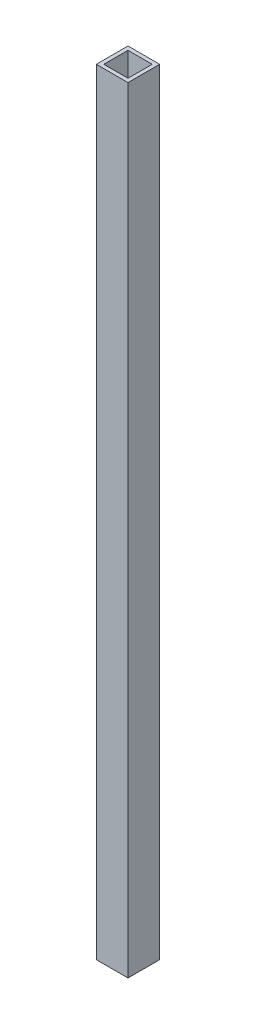
ISO-10303-21;
HEADER;
FILE_DESCRIPTION(('STEP AP214'),'2;1');
FILE_NAME('part.step','',(''),(''),'','','');
FILE_SCHEMA(('AUTOMOTIVE_DESIGN { 1 0 10303 214 1 1 1 1 }'));
ENDSEC;
DATA;
#1=APPLICATION_CONTEXT('core data for automotive mechanical design processes');
#2=APPLICATION_PROTOCOL_DEFINITION('international standard','automotive_design',2000,#1);
#3=PRODUCT_CONTEXT('',#1,'mechanical');
#4=PRODUCT('Part','Part','',(#3));
#5=PRODUCT_RELATED_PRODUCT_CATEGORY('part','',(#4));
#6=PRODUCT_DEFINITION_FORMATION('','',#4);
#7=PRODUCT_DEFINITION_CONTEXT('part definition',#1,'design');
#8=PRODUCT_DEFINITION('design','',#6,#7);
#9=PRODUCT_DEFINITION_SHAPE('','',#8);
#10=(LENGTH_UNIT() NAMED_UNIT(*) SI_UNIT(.MILLI.,.METRE.));
#11=(NAMED_UNIT(*) PLANE_ANGLE_UNIT() SI_UNIT($,.RADIAN.));
#12=(NAMED_UNIT(*) SI_UNIT($,.STERADIAN.) SOLID_ANGLE_UNIT());
#13=UNCERTAINTY_MEASURE_WITH_UNIT(LENGTH_MEASURE(1.E-05),#10,'distance_accuracy_value','');
#14=(GEOMETRIC_REPRESENTATION_CONTEXT(3) GLOBAL_UNCERTAINTY_ASSIGNED_CONTEXT((#13)) GLOBAL_UNIT_ASSIGNED_CONTEXT((#10,
#11,#12)) REPRESENTATION_CONTEXT('',''));
#15=CARTESIAN_POINT('',(0.,0.,0.));
#16=DIRECTION('',(0.,0.,1.));
#17=DIRECTION('',(1.,0.,0.));
#18=AXIS2_PLACEMENT_3D('',#15,#16,#17);
#19=CARTESIAN_POINT('',(0.,208.245,0.));
#20=DIRECTION('',(0.,-1.,0.));
#21=DIRECTION('',(0.,0.,-1.));
#22=AXIS2_PLACEMENT_3D('',#19,#20,#21);
#23=PLANE('',#22);
#24=DIRECTION('',(0.,0.,1.));
#25=VECTOR('',#24,1.);
#26=CARTESIAN_POINT('',(15.8767045454545,208.245,-21.8352272727272));
#27=LINE('',#26,#25);
#28=CARTESIAN_POINT('',(15.8767045454545,208.245,-30.3352272727272));
#29=VERTEX_POINT('',#28);
#30=CARTESIAN_POINT('',(15.8767045454545,208.245,-21.8352272727272));
#31=VERTEX_POINT('',#30);
#32=EDGE_CURVE('E156',#29,#31,#27,.T.);
#33=ORIENTED_EDGE('',*,*,#32,.T.);
#34=DIRECTION('',(1.,0.,0.));
#35=VECTOR('',#34,1.);
#36=CARTESIAN_POINT('',(15.8767045454545,208.245,-21.8352272727272));
#37=LINE('',#36,#35);
#38=CARTESIAN_POINT('',(24.3767045454545,208.245,-21.8352272727272));
#39=VERTEX_POINT('',#38);
#40=EDGE_CURVE('E160',#31,#39,#37,.T.);
#41=ORIENTED_EDGE('',*,*,#40,.T.);
#42=DIRECTION('',(0.,0.,-1.));
#43=VECTOR('',#42,1.);
#44=CARTESIAN_POINT('',(24.3767045454545,208.245,-21.8352272727272));
#45=LINE('',#44,#43);
#46=CARTESIAN_POINT('',(24.3767045454545,208.245,-30.3352272727272));
#47=VERTEX_POINT('',#46);
#48=EDGE_CURVE('E164',#39,#47,#45,.T.);
#49=ORIENTED_EDGE('',*,*,#48,.T.);
#50=DIRECTION('',(-1.,0.,0.));
#51=VECTOR('',#50,1.);
#52=CARTESIAN_POINT('',(15.8767045454545,208.245,-30.3352272727272));
#53=LINE('',#52,#51);
#54=EDGE_CURVE('E167',#47,#29,#53,.T.);
#55=ORIENTED_EDGE('',*,*,#54,.T.);
#56=EDGE_LOOP('',(#33,#41,#49,#55));
#57=FACE_BOUND('',#56,.T.);
#58=DIRECTION('',(0.,0.,1.));
#59=VECTOR('',#58,1.);
#60=CARTESIAN_POINT('',(16.8767045454545,208.245,-29.3352272727272));
#61=LINE('',#60,#59);
#62=CARTESIAN_POINT('',(16.8767045454545,208.245,-29.3352272727272));
#63=VERTEX_POINT('',#62);
#64=CARTESIAN_POINT('',(16.8767045454545,208.245,-22.8352272727272));
#65=VERTEX_POINT('',#64);
#66=EDGE_CURVE('E108',#63,#65,#61,.T.);
#67=ORIENTED_EDGE('',*,*,#66,.F.);
#68=DIRECTION('',(-1.,0.,0.));
#69=VECTOR('',#68,1.);
#70=CARTESIAN_POINT('',(16.8767045454545,208.245,-29.3352272727272));
#71=LINE('',#70,#69);
#72=CARTESIAN_POINT('',(23.3767045454545,208.245,-29.3352272727272));
#73=VERTEX_POINT('',#72);
#74=EDGE_CURVE('E134',#73,#63,#71,.T.);
#75=ORIENTED_EDGE('',*,*,#74,.F.);
#76=DIRECTION('',(0.,0.,-1.));
#77=VECTOR('',#76,1.);
#78=CARTESIAN_POINT('',(23.3767045454545,208.245,-29.3352272727272));
#79=LINE('',#78,#77);
#80=CARTESIAN_POINT('',(23.3767045454545,208.245,-22.8352272727272));
#81=VERTEX_POINT('',#80);
#82=EDGE_CURVE('E130',#81,#73,#79,.T.);
#83=ORIENTED_EDGE('',*,*,#82,.F.);
#84=DIRECTION('',(1.,0.,0.));
#85=VECTOR('',#84,1.);
#86=CARTESIAN_POINT('',(16.8767045454545,208.245,-22.8352272727272));
#87=LINE('',#86,#85);
#88=EDGE_CURVE('E117',#65,#81,#87,.T.);
#89=ORIENTED_EDGE('',*,*,#88,.F.);
#90=EDGE_LOOP('',(#67,#75,#83,#89));
#91=FACE_BOUND('',#90,.T.);
#92=ADVANCED_FACE('F42',(#57,#91),#23,.F.);
#93=CARTESIAN_POINT('',(0.,0.,0.));
#94=DIRECTION('',(0.,-1.,0.));
#95=DIRECTION('',(0.,0.,-1.));
#96=AXIS2_PLACEMENT_3D('',#93,#94,#95);
#97=PLANE('',#96);
#98=DIRECTION('',(0.,0.,1.));
#99=VECTOR('',#98,1.);
#100=CARTESIAN_POINT('',(15.8767045454545,0.,-21.8352272727272));
#101=LINE('',#100,#99);
#102=CARTESIAN_POINT('',(15.8767045454545,0.,-30.3352272727272));
#103=VERTEX_POINT('',#102);
#104=CARTESIAN_POINT('',(15.8767045454545,0.,-21.8352272727272));
#105=VERTEX_POINT('',#104);
#106=EDGE_CURVE('E126',#103,#105,#101,.T.);
#107=ORIENTED_EDGE('',*,*,#106,.F.);
#108=DIRECTION('',(-1.,0.,0.));
#109=VECTOR('',#108,1.);
#110=CARTESIAN_POINT('',(15.8767045454545,0.,-30.3352272727272));
#111=LINE('',#110,#109);
#112=CARTESIAN_POINT('',(24.3767045454545,0.,-30.3352272727272));
#113=VERTEX_POINT('',#112);
#114=EDGE_CURVE('E161',#113,#103,#111,.T.);
#115=ORIENTED_EDGE('',*,*,#114,.F.);
#116=DIRECTION('',(0.,0.,-1.));
#117=VECTOR('',#116,1.);
#118=CARTESIAN_POINT('',(24.3767045454545,0.,-21.8352272727272));
#119=LINE('',#118,#117);
#120=CARTESIAN_POINT('',(24.3767045454545,0.,-21.8352272727272));
#121=VERTEX_POINT('',#120);
#122=EDGE_CURVE('E177',#121,#113,#119,.T.);
#123=ORIENTED_EDGE('',*,*,#122,.F.);
#124=DIRECTION('',(1.,0.,0.));
#125=VECTOR('',#124,1.);
#126=CARTESIAN_POINT('',(15.8767045454545,0.,-21.8352272727272));
#127=LINE('',#126,#125);
#128=EDGE_CURVE('E174',#105,#121,#127,.T.);
#129=ORIENTED_EDGE('',*,*,#128,.F.);
#130=EDGE_LOOP('',(#107,#115,#123,#129));
#131=FACE_BOUND('',#130,.T.);
#132=DIRECTION('',(-1.,0.,0.));
#133=VECTOR('',#132,1.);
#134=CARTESIAN_POINT('',(16.8767045454545,0.,-29.3352272727272));
#135=LINE('',#134,#133);
#136=CARTESIAN_POINT('',(23.3767045454545,0.,-29.3352272727272));
#137=VERTEX_POINT('',#136);
#138=CARTESIAN_POINT('',(16.8767045454545,0.,-29.3352272727272));
#139=VERTEX_POINT('',#138);
#140=EDGE_CURVE('E118',#137,#139,#135,.T.);
#141=ORIENTED_EDGE('',*,*,#140,.T.);
#142=DIRECTION('',(0.,0.,1.));
#143=VECTOR('',#142,1.);
#144=CARTESIAN_POINT('',(16.8767045454545,0.,-29.3352272727272));
#145=LINE('',#144,#143);
#146=CARTESIAN_POINT('',(16.8767045454545,0.,-22.8352272727272));
#147=VERTEX_POINT('',#146);
#148=EDGE_CURVE('E66',#139,#147,#145,.T.);
#149=ORIENTED_EDGE('',*,*,#148,.T.);
#150=DIRECTION('',(1.,0.,0.));
#151=VECTOR('',#150,1.);
#152=CARTESIAN_POINT('',(16.8767045454545,0.,-22.8352272727272));
#153=LINE('',#152,#151);
#154=CARTESIAN_POINT('',(23.3767045454545,0.,-22.8352272727272));
#155=VERTEX_POINT('',#154);
#156=EDGE_CURVE('E124',#147,#155,#153,.T.);
#157=ORIENTED_EDGE('',*,*,#156,.T.);
#158=DIRECTION('',(0.,0.,-1.));
#159=VECTOR('',#158,1.);
#160=CARTESIAN_POINT('',(23.3767045454545,0.,-29.3352272727272));
#161=LINE('',#160,#159);
#162=EDGE_CURVE('E143',#155,#137,#161,.T.);
#163=ORIENTED_EDGE('',*,*,#162,.T.);
#164=EDGE_LOOP('',(#141,#149,#157,#163));
#165=FACE_BOUND('',#164,.T.);
#166=ADVANCED_FACE('F200',(#131,#165),#97,.T.);
#167=CARTESIAN_POINT('',(15.8767045454545,208.245,-21.8352272727272));
#168=DIRECTION('',(1.,0.,0.));
#169=DIRECTION('',(0.,0.,-1.));
#170=AXIS2_PLACEMENT_3D('',#167,#168,#169);
#171=PLANE('',#170);
#172=ORIENTED_EDGE('',*,*,#106,.T.);
#173=DIRECTION('',(0.,-1.,0.));
#174=VECTOR('',#173,1.);
#175=CARTESIAN_POINT('',(15.8767045454545,208.245,-21.8352272727272));
#176=LINE('',#175,#174);
#177=EDGE_CURVE('E11',#31,#105,#176,.T.);
#178=ORIENTED_EDGE('',*,*,#177,.F.);
#179=ORIENTED_EDGE('',*,*,#32,.F.);
#180=DIRECTION('',(0.,-1.,0.));
#181=VECTOR('',#180,1.);
#182=CARTESIAN_POINT('',(15.8767045454545,208.245,-30.3352272727272));
#183=LINE('',#182,#181);
#184=EDGE_CURVE('E170',#29,#103,#183,.T.);
#185=ORIENTED_EDGE('',*,*,#184,.T.);
#186=EDGE_LOOP('',(#172,#178,#179,#185));
#187=FACE_BOUND('',#186,.T.);
#188=ADVANCED_FACE('F44',(#187),#171,.F.);
#189=CARTESIAN_POINT('',(15.8767045454545,208.245,-21.8352272727272));
#190=DIRECTION('',(0.,0.,-1.));
#191=DIRECTION('',(-1.,0.,0.));
#192=AXIS2_PLACEMENT_3D('',#189,#190,#191);
#193=PLANE('',#192);
#194=ORIENTED_EDGE('',*,*,#128,.T.);
#195=DIRECTION('',(0.,-1.,0.));
#196=VECTOR('',#195,1.);
#197=CARTESIAN_POINT('',(24.3767045454545,208.245,-21.8352272727272));
#198=LINE('',#197,#196);
#199=EDGE_CURVE('E51',#39,#121,#198,.T.);
#200=ORIENTED_EDGE('',*,*,#199,.F.);
#201=ORIENTED_EDGE('',*,*,#40,.F.);
#202=ORIENTED_EDGE('',*,*,#177,.T.);
#203=EDGE_LOOP('',(#194,#200,#201,#202));
#204=FACE_BOUND('',#203,.T.);
#205=ADVANCED_FACE('F210',(#204),#193,.F.);
#206=CARTESIAN_POINT('',(24.3767045454545,208.245,-21.8352272727272));
#207=DIRECTION('',(-1.,0.,0.));
#208=DIRECTION('',(0.,0.,1.));
#209=AXIS2_PLACEMENT_3D('',#206,#207,#208);
#210=PLANE('',#209);
#211=ORIENTED_EDGE('',*,*,#122,.T.);
#212=DIRECTION('',(0.,-1.,0.));
#213=VECTOR('',#212,1.);
#214=CARTESIAN_POINT('',(24.3767045454545,208.245,-30.3352272727272));
#215=LINE('',#214,#213);
#216=EDGE_CURVE('E185',#47,#113,#215,.T.);
#217=ORIENTED_EDGE('',*,*,#216,.F.);
#218=ORIENTED_EDGE('',*,*,#48,.F.);
#219=ORIENTED_EDGE('',*,*,#199,.T.);
#220=EDGE_LOOP('',(#211,#217,#218,#219));
#221=FACE_BOUND('',#220,.T.);
#222=ADVANCED_FACE('F194',(#221),#210,.F.);
#223=CARTESIAN_POINT('',(15.8767045454545,208.245,-30.3352272727272));
#224=DIRECTION('',(0.,0.,1.));
#225=DIRECTION('',(1.,0.,0.));
#226=AXIS2_PLACEMENT_3D('',#223,#224,#225);
#227=PLANE('',#226);
#228=ORIENTED_EDGE('',*,*,#114,.T.);
#229=ORIENTED_EDGE('',*,*,#184,.F.);
#230=ORIENTED_EDGE('',*,*,#54,.F.);
#231=ORIENTED_EDGE('',*,*,#216,.T.);
#232=EDGE_LOOP('',(#228,#229,#230,#231));
#233=FACE_BOUND('',#232,.T.);
#234=ADVANCED_FACE('F204',(#233),#227,.F.);
#235=CARTESIAN_POINT('',(16.8767045454545,208.245,-29.3352272727272));
#236=DIRECTION('',(1.,0.,0.));
#237=DIRECTION('',(0.,0.,-1.));
#238=AXIS2_PLACEMENT_3D('',#235,#236,#237);
#239=PLANE('',#238);
#240=ORIENTED_EDGE('',*,*,#148,.F.);
#241=DIRECTION('',(0.,-1.,0.));
#242=VECTOR('',#241,1.);
#243=CARTESIAN_POINT('',(16.8767045454545,208.245,-29.3352272727272));
#244=LINE('',#243,#242);
#245=EDGE_CURVE('E112',#63,#139,#244,.T.);
#246=ORIENTED_EDGE('',*,*,#245,.F.);
#247=ORIENTED_EDGE('',*,*,#66,.T.);
#248=DIRECTION('',(0.,-1.,0.));
#249=VECTOR('',#248,1.);
#250=CARTESIAN_POINT('',(16.8767045454545,208.245,-22.8352272727272));
#251=LINE('',#250,#249);
#252=EDGE_CURVE('E111',#65,#147,#251,.T.);
#253=ORIENTED_EDGE('',*,*,#252,.T.);
#254=EDGE_LOOP('',(#240,#246,#247,#253));
#255=FACE_BOUND('',#254,.T.);
#256=ADVANCED_FACE('F110',(#255),#239,.T.);
#257=CARTESIAN_POINT('',(16.8767045454545,208.245,-22.8352272727272));
#258=DIRECTION('',(0.,0.,-1.));
#259=DIRECTION('',(-1.,0.,0.));
#260=AXIS2_PLACEMENT_3D('',#257,#258,#259);
#261=PLANE('',#260);
#262=ORIENTED_EDGE('',*,*,#156,.F.);
#263=ORIENTED_EDGE('',*,*,#252,.F.);
#264=ORIENTED_EDGE('',*,*,#88,.T.);
#265=DIRECTION('',(0.,-1.,0.));
#266=VECTOR('',#265,1.);
#267=CARTESIAN_POINT('',(23.3767045454545,208.245,-22.8352272727272));
#268=LINE('',#267,#266);
#269=EDGE_CURVE('E127',#81,#155,#268,.T.);
#270=ORIENTED_EDGE('',*,*,#269,.T.);
#271=EDGE_LOOP('',(#262,#263,#264,#270));
#272=FACE_BOUND('',#271,.T.);
#273=ADVANCED_FACE('F121',(#272),#261,.T.);
#274=CARTESIAN_POINT('',(23.3767045454545,208.245,-29.3352272727272));
#275=DIRECTION('',(-1.,0.,0.));
#276=DIRECTION('',(0.,0.,1.));
#277=AXIS2_PLACEMENT_3D('',#274,#275,#276);
#278=PLANE('',#277);
#279=ORIENTED_EDGE('',*,*,#162,.F.);
#280=ORIENTED_EDGE('',*,*,#269,.F.);
#281=ORIENTED_EDGE('',*,*,#82,.T.);
#282=DIRECTION('',(0.,-1.,0.));
#283=VECTOR('',#282,1.);
#284=CARTESIAN_POINT('',(23.3767045454545,208.245,-29.3352272727272));
#285=LINE('',#284,#283);
#286=EDGE_CURVE('E58',#73,#137,#285,.T.);
#287=ORIENTED_EDGE('',*,*,#286,.T.);
#288=EDGE_LOOP('',(#279,#280,#281,#287));
#289=FACE_BOUND('',#288,.T.);
#290=ADVANCED_FACE('F233',(#289),#278,.T.);
#291=CARTESIAN_POINT('',(16.8767045454545,208.245,-29.3352272727272));
#292=DIRECTION('',(0.,0.,1.));
#293=DIRECTION('',(1.,0.,0.));
#294=AXIS2_PLACEMENT_3D('',#291,#292,#293);
#295=PLANE('',#294);
#296=ORIENTED_EDGE('',*,*,#140,.F.);
#297=ORIENTED_EDGE('',*,*,#286,.F.);
#298=ORIENTED_EDGE('',*,*,#74,.T.);
#299=ORIENTED_EDGE('',*,*,#245,.T.);
#300=EDGE_LOOP('',(#296,#297,#298,#299));
#301=FACE_BOUND('',#300,.T.);
#302=ADVANCED_FACE('F237',(#301),#295,.T.);
#303=CLOSED_SHELL('',(#92,#166,#188,#205,#222,#234,#256,#273,#290,#302));
#304=MANIFOLD_SOLID_BREP('B2',#303);
#305=ADVANCED_BREP_SHAPE_REPRESENTATION('',(#18,#304),#14);
#306=SHAPE_DEFINITION_REPRESENTATION(#9,#305);
ENDSEC;
END-ISO-10303-21;
